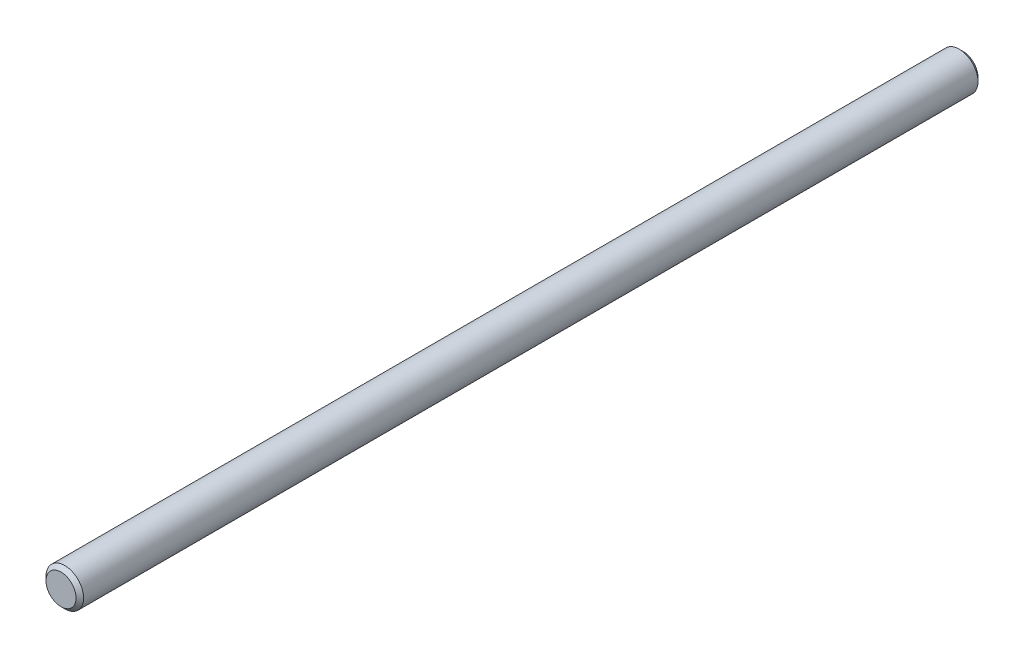
ISO-10303-21;
HEADER;
FILE_DESCRIPTION(('STEP AP214'),'2;1');
FILE_NAME('part.step','',(''),(''),'','','');
FILE_SCHEMA(('AUTOMOTIVE_DESIGN { 1 0 10303 214 1 1 1 1 }'));
ENDSEC;
DATA;
#1=APPLICATION_CONTEXT('core data for automotive mechanical design processes');
#2=APPLICATION_PROTOCOL_DEFINITION('international standard','automotive_design',2000,#1);
#3=PRODUCT_CONTEXT('',#1,'mechanical');
#4=PRODUCT('Part','Part','',(#3));
#5=PRODUCT_RELATED_PRODUCT_CATEGORY('part','',(#4));
#6=PRODUCT_DEFINITION_FORMATION('','',#4);
#7=PRODUCT_DEFINITION_CONTEXT('part definition',#1,'design');
#8=PRODUCT_DEFINITION('design','',#6,#7);
#9=PRODUCT_DEFINITION_SHAPE('','',#8);
#10=(LENGTH_UNIT() NAMED_UNIT(*) SI_UNIT(.MILLI.,.METRE.));
#11=(NAMED_UNIT(*) PLANE_ANGLE_UNIT() SI_UNIT($,.RADIAN.));
#12=(NAMED_UNIT(*) SI_UNIT($,.STERADIAN.) SOLID_ANGLE_UNIT());
#13=UNCERTAINTY_MEASURE_WITH_UNIT(LENGTH_MEASURE(1.E-05),#10,'distance_accuracy_value','');
#14=(GEOMETRIC_REPRESENTATION_CONTEXT(3) GLOBAL_UNCERTAINTY_ASSIGNED_CONTEXT((#13)) GLOBAL_UNIT_ASSIGNED_CONTEXT((#10,
#11,#12)) REPRESENTATION_CONTEXT('',''));
#15=CARTESIAN_POINT('',(0.,0.,0.));
#16=DIRECTION('',(0.,0.,1.));
#17=DIRECTION('',(1.,0.,0.));
#18=AXIS2_PLACEMENT_3D('',#15,#16,#17);
#19=CARTESIAN_POINT('',(0.,0.,38.1));
#20=DIRECTION('',(0.,0.,-1.));
#21=DIRECTION('',(-1.,0.,0.));
#22=AXIS2_PLACEMENT_3D('',#19,#20,#21);
#23=CYLINDRICAL_SURFACE('',#22,1.5875);
#24=CARTESIAN_POINT('',(0.,0.,-37.7824999999999));
#25=DIRECTION('',(0.,0.,1.));
#26=DIRECTION('',(1.,0.,0.));
#27=AXIS2_PLACEMENT_3D('',#24,#25,#26);
#28=CIRCLE('',#27,1.5875);
#29=CARTESIAN_POINT('',(-1.5875,0.,-37.7824999999999));
#30=VERTEX_POINT('',#29);
#31=EDGE_CURVE('E41',#30,#30,#28,.T.);
#32=CARTESIAN_POINT('',(0.,0.,37.7825));
#33=DIRECTION('',(0.,0.,1.));
#34=DIRECTION('',(1.,0.,0.));
#35=AXIS2_PLACEMENT_3D('',#32,#33,#34);
#36=CIRCLE('',#35,1.5875);
#37=CARTESIAN_POINT('',(-1.5875,0.,37.7825));
#38=VERTEX_POINT('',#37);
#39=EDGE_CURVE('E45',#38,#38,#36,.F.);
#40=CARTESIAN_POINT('',(-1.5875,0.,-37.7824999999999));
#41=CARTESIAN_POINT('',(-1.5875,0.,-36.9953645833333));
#42=CARTESIAN_POINT('',(-1.5875,0.,-36.2082291666666));
#43=CARTESIAN_POINT('',(-1.5875,0.,-34.6339583333333));
#44=CARTESIAN_POINT('',(-1.5875,0.,-33.8468229166666));
#45=CARTESIAN_POINT('',(-1.5875,0.,-32.2725520833333));
#46=CARTESIAN_POINT('',(-1.5875,0.,-31.4854166666666));
#47=CARTESIAN_POINT('',(-1.5875,0.,-29.9111458333333));
#48=CARTESIAN_POINT('',(-1.5875,0.,-29.1240104166666));
#49=CARTESIAN_POINT('',(-1.5875,0.,-27.5497395833333));
#50=CARTESIAN_POINT('',(-1.5875,0.,-26.7626041666666));
#51=CARTESIAN_POINT('',(-1.5875,0.,-25.1883333333333));
#52=CARTESIAN_POINT('',(-1.5875,0.,-24.4011979166666));
#53=CARTESIAN_POINT('',(-1.5875,0.,-22.8269270833333));
#54=CARTESIAN_POINT('',(-1.5875,0.,-22.0397916666666));
#55=CARTESIAN_POINT('',(-1.5875,0.,-20.4655208333333));
#56=CARTESIAN_POINT('',(-1.5875,0.,-19.6783854166666));
#57=CARTESIAN_POINT('',(-1.5875,0.,-18.1041145833333));
#58=CARTESIAN_POINT('',(-1.5875,0.,-17.3169791666666));
#59=CARTESIAN_POINT('',(-1.5875,0.,-15.7427083333333));
#60=CARTESIAN_POINT('',(-1.5875,0.,-14.9555729166666));
#61=CARTESIAN_POINT('',(-1.5875,0.,-13.3813020833333));
#62=CARTESIAN_POINT('',(-1.5875,0.,-12.5941666666666));
#63=CARTESIAN_POINT('',(-1.5875,0.,-11.0198958333333));
#64=CARTESIAN_POINT('',(-1.5875,0.,-10.2327604166666));
#65=CARTESIAN_POINT('',(-1.5875,0.,-8.65848958333329));
#66=CARTESIAN_POINT('',(-1.5875,0.,-7.87135416666662));
#67=CARTESIAN_POINT('',(-1.5875,0.,-6.29708333333329));
#68=CARTESIAN_POINT('',(-1.5875,0.,-5.50994791666662));
#69=CARTESIAN_POINT('',(-1.5875,0.,-3.93567708333329));
#70=CARTESIAN_POINT('',(-1.5875,0.,-3.14854166666662));
#71=CARTESIAN_POINT('',(-1.5875,0.,-1.57427083333329));
#72=CARTESIAN_POINT('',(-1.5875,0.,-0.787135416666619));
#73=CARTESIAN_POINT('',(-1.5875,0.,0.787135416666716));
#74=CARTESIAN_POINT('',(-1.5875,0.,1.57427083333338));
#75=CARTESIAN_POINT('',(-1.5875,0.,3.14854166666672));
#76=CARTESIAN_POINT('',(-1.5875,0.,3.93567708333338));
#77=CARTESIAN_POINT('',(-1.5875,0.,5.50994791666672));
#78=CARTESIAN_POINT('',(-1.5875,0.,6.29708333333338));
#79=CARTESIAN_POINT('',(-1.5875,0.,7.87135416666671));
#80=CARTESIAN_POINT('',(-1.5875,0.,8.65848958333338));
#81=CARTESIAN_POINT('',(-1.5875,0.,10.2327604166667));
#82=CARTESIAN_POINT('',(-1.5875,0.,11.0198958333334));
#83=CARTESIAN_POINT('',(-1.5875,0.,12.5941666666667));
#84=CARTESIAN_POINT('',(-1.5875,0.,13.3813020833334));
#85=CARTESIAN_POINT('',(-1.5875,0.,14.9555729166667));
#86=CARTESIAN_POINT('',(-1.5875,0.,15.7427083333334));
#87=CARTESIAN_POINT('',(-1.5875,0.,17.3169791666667));
#88=CARTESIAN_POINT('',(-1.5875,0.,18.1041145833334));
#89=CARTESIAN_POINT('',(-1.5875,0.,19.6783854166667));
#90=CARTESIAN_POINT('',(-1.5875,0.,20.4655208333334));
#91=CARTESIAN_POINT('',(-1.5875,0.,22.0397916666667));
#92=CARTESIAN_POINT('',(-1.5875,0.,22.8269270833334));
#93=CARTESIAN_POINT('',(-1.5875,0.,24.4011979166667));
#94=CARTESIAN_POINT('',(-1.5875,0.,25.1883333333334));
#95=CARTESIAN_POINT('',(-1.5875,0.,26.7626041666667));
#96=CARTESIAN_POINT('',(-1.5875,0.,27.5497395833334));
#97=CARTESIAN_POINT('',(-1.5875,0.,29.1240104166667));
#98=CARTESIAN_POINT('',(-1.5875,0.,29.9111458333334));
#99=CARTESIAN_POINT('',(-1.5875,0.,31.4854166666667));
#100=CARTESIAN_POINT('',(-1.5875,0.,32.2725520833334));
#101=CARTESIAN_POINT('',(-1.5875,0.,33.8468229166667));
#102=CARTESIAN_POINT('',(-1.5875,0.,34.6339583333334));
#103=CARTESIAN_POINT('',(-1.5875,0.,36.2082291666667));
#104=CARTESIAN_POINT('',(-1.5875,0.,36.9953645833334));
#105=CARTESIAN_POINT('',(-1.5875,0.,37.7825));
#106=B_SPLINE_CURVE_WITH_KNOTS('',3,(#40,#41,#42,#43,#44,#45,#46,#47,#48,#49,#50,#51,#52,#53,
#54,#55,#56,#57,#58,#59,#60,#61,#62,#63,#64,#65,#66,#67,#68,#69,#70,#71,#72,#73,#74,#75,#76,#77,
#78,#79,#80,#81,#82,#83,#84,#85,#86,#87,#88,#89,#90,#91,#92,#93,#94,#95,#96,#97,#98,#99,#100,
#101,#102,#103,#104,#105),.UNSPECIFIED.,.F.,.F.,(4,2,2,2,2,2,2,2,2,2,2,2,2,2,2,2,2,2,2,2,2,2,2,
2,2,2,2,2,2,2,2,2,4),(0.,2.36140625,4.72281250000001,7.08421875,9.445625,11.80703125,14.1684375,
16.52984375,18.89125,21.25265625,23.6140625,25.97546875,28.336875,30.69828125,33.0596875,
35.42109375,37.7825,40.14390625,42.5053125,44.86671875,47.228125,49.58953125,51.9509375,
54.31234375,56.67375,59.03515625,61.3965625,63.75796875,66.119375,68.48078125,70.8421875,
73.20359375,75.565),.UNSPECIFIED.);
#107=EDGE_CURVE('BSEAM30',#30,#38,#106,.T.);
#108=ORIENTED_EDGE('',*,*,#31,.T.);
#109=ORIENTED_EDGE('',*,*,#39,.T.);
#110=ORIENTED_EDGE('',*,*,#107,.T.);
#111=ORIENTED_EDGE('',*,*,#107,.F.);
#112=EDGE_LOOP('',(#108,#110,#109,#111));
#113=FACE_BOUND('',#112,.T.);
#114=ADVANCED_FACE('F30',(#113),#23,.T.);
#115=CARTESIAN_POINT('',(0.,0.,38.1));
#116=DIRECTION('',(0.,0.,1.));
#117=DIRECTION('',(1.,0.,0.));
#118=AXIS2_PLACEMENT_3D('',#115,#116,#117);
#119=PLANE('',#118);
#120=CARTESIAN_POINT('',(0.,0.,38.1));
#121=DIRECTION('',(0.,0.,1.));
#122=DIRECTION('',(1.,0.,0.));
#123=AXIS2_PLACEMENT_3D('',#120,#121,#122);
#124=CIRCLE('',#123,1.27000000000004);
#125=CARTESIAN_POINT('',(1.27000000000004,0.,38.1));
#126=VERTEX_POINT('',#125);
#127=EDGE_CURVE('E10',#126,#126,#124,.T.);
#128=ORIENTED_EDGE('',*,*,#127,.T.);
#129=EDGE_LOOP('',(#128));
#130=FACE_BOUND('',#129,.T.);
#131=ADVANCED_FACE('F61',(#130),#119,.T.);
#132=CARTESIAN_POINT('',(0.,0.,-38.1));
#133=DIRECTION('',(0.,0.,1.));
#134=DIRECTION('',(1.,0.,0.));
#135=AXIS2_PLACEMENT_3D('',#132,#133,#134);
#136=PLANE('',#135);
#137=CARTESIAN_POINT('',(0.,0.,-38.1));
#138=DIRECTION('',(0.,0.,1.));
#139=DIRECTION('',(1.,0.,0.));
#140=AXIS2_PLACEMENT_3D('',#137,#138,#139);
#141=CIRCLE('',#140,1.26999999999994);
#142=CARTESIAN_POINT('',(1.26999999999994,0.,-38.1));
#143=VERTEX_POINT('',#142);
#144=EDGE_CURVE('E37',#143,#143,#141,.F.);
#145=ORIENTED_EDGE('',*,*,#144,.T.);
#146=EDGE_LOOP('',(#145));
#147=FACE_BOUND('',#146,.T.);
#148=ADVANCED_FACE('F58',(#147),#136,.F.);
#149=CARTESIAN_POINT('',(0.,0.,-37.7824999999999));
#150=DIRECTION('',(0.,0.,1.));
#151=DIRECTION('',(1.,0.,0.));
#152=AXIS2_PLACEMENT_3D('',#149,#150,#151);
#153=CONICAL_SURFACE('',#152,1.5875,0.78539816339744);
#154=ORIENTED_EDGE('',*,*,#144,.F.);
#155=EDGE_LOOP('',(#154));
#156=FACE_BOUND('',#155,.T.);
#157=ORIENTED_EDGE('',*,*,#31,.F.);
#158=EDGE_LOOP('',(#157));
#159=FACE_BOUND('',#158,.T.);
#160=ADVANCED_FACE('F54',(#156,#159),#153,.T.);
#161=CARTESIAN_POINT('',(0.,0.,38.1));
#162=DIRECTION('',(0.,0.,-1.));
#163=DIRECTION('',(-1.,0.,0.));
#164=AXIS2_PLACEMENT_3D('',#161,#162,#163);
#165=CONICAL_SURFACE('',#164,1.27000000000004,0.785398163397451);
#166=ORIENTED_EDGE('',*,*,#39,.F.);
#167=EDGE_LOOP('',(#166));
#168=FACE_BOUND('',#167,.T.);
#169=ORIENTED_EDGE('',*,*,#127,.F.);
#170=EDGE_LOOP('',(#169));
#171=FACE_BOUND('',#170,.T.);
#172=ADVANCED_FACE('F32',(#168,#171),#165,.T.);
#173=CLOSED_SHELL('',(#114,#131,#148,#160,#172));
#174=MANIFOLD_SOLID_BREP('B2',#173);
#175=ADVANCED_BREP_SHAPE_REPRESENTATION('',(#18,#174),#14);
#176=SHAPE_DEFINITION_REPRESENTATION(#9,#175);
ENDSEC;
END-ISO-10303-21;
